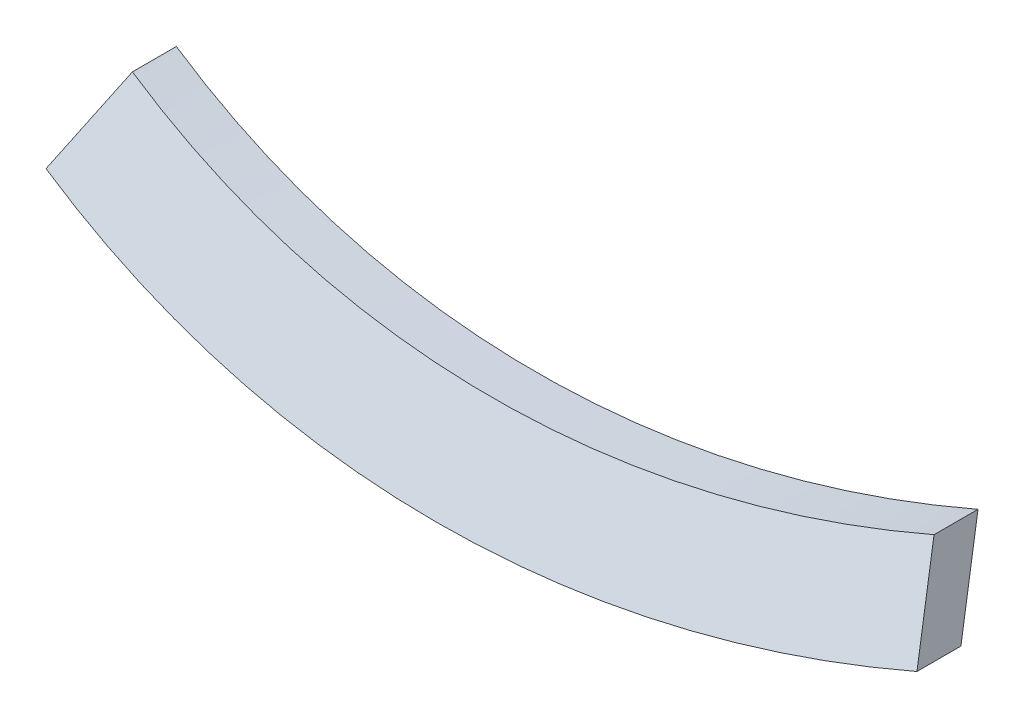
ISO-10303-21;
HEADER;
FILE_DESCRIPTION(('STEP AP214'),'2;1');
FILE_NAME('part.step','',(''),(''),'','','');
FILE_SCHEMA(('AUTOMOTIVE_DESIGN { 1 0 10303 214 1 1 1 1 }'));
ENDSEC;
DATA;
#1=APPLICATION_CONTEXT('core data for automotive mechanical design processes');
#2=APPLICATION_PROTOCOL_DEFINITION('international standard','automotive_design',2000,#1);
#3=PRODUCT_CONTEXT('',#1,'mechanical');
#4=PRODUCT('Part','Part','',(#3));
#5=PRODUCT_RELATED_PRODUCT_CATEGORY('part','',(#4));
#6=PRODUCT_DEFINITION_FORMATION('','',#4);
#7=PRODUCT_DEFINITION_CONTEXT('part definition',#1,'design');
#8=PRODUCT_DEFINITION('design','',#6,#7);
#9=PRODUCT_DEFINITION_SHAPE('','',#8);
#10=(LENGTH_UNIT() NAMED_UNIT(*) SI_UNIT(.MILLI.,.METRE.));
#11=(NAMED_UNIT(*) PLANE_ANGLE_UNIT() SI_UNIT($,.RADIAN.));
#12=(NAMED_UNIT(*) SI_UNIT($,.STERADIAN.) SOLID_ANGLE_UNIT());
#13=UNCERTAINTY_MEASURE_WITH_UNIT(LENGTH_MEASURE(1.E-05),#10,'distance_accuracy_value','');
#14=(GEOMETRIC_REPRESENTATION_CONTEXT(3) GLOBAL_UNCERTAINTY_ASSIGNED_CONTEXT((#13)) GLOBAL_UNIT_ASSIGNED_CONTEXT((#10,
#11,#12)) REPRESENTATION_CONTEXT('',''));
#15=CARTESIAN_POINT('',(0.,0.,0.));
#16=DIRECTION('',(0.,0.,1.));
#17=DIRECTION('',(1.,0.,0.));
#18=AXIS2_PLACEMENT_3D('',#15,#16,#17);
#19=CARTESIAN_POINT('',(0.,-126.899387052667,-166.639753894631));
#20=DIRECTION('',(0.,-0.56640623692483,-0.824126188622017));
#21=DIRECTION('',(0.,0.824126188622017,-0.56640623692483));
#22=AXIS2_PLACEMENT_3D('',#19,#20,#21);
#23=PLANE('',#22);
#24=DIRECTION('',(0.354677344708417,-0.770548723105769,0.52958346506538));
#25=VECTOR('',#24,1.);
#26=CARTESIAN_POINT('',(178.284528713164,-79.5509102038807,-199.181460451591));
#27=LINE('',#26,#25);
#28=CARTESIAN_POINT('',(164.097434924827,-48.72896127965,-220.364799054206));
#29=VERTEX_POINT('',#28);
#30=CARTESIAN_POINT('',(178.284528713164,-79.5509102038808,-199.181460451591));
#31=VERTEX_POINT('',#30);
#32=EDGE_CURVE('E81',#29,#31,#27,.T.);
#33=ORIENTED_EDGE('',*,*,#32,.F.);
#34=CARTESIAN_POINT('',(0.,307.778356801829,-465.385490373735));
#35=DIRECTION('',(0.,0.566406236924833,0.824126188622016));
#36=DIRECTION('',(0.,0.824126188622016,-0.566406236924833));
#37=AXIS2_PLACEMENT_3D('',#34,#35,#36);
#38=CIRCLE('',#37,462.666807939857);
#39=CARTESIAN_POINT('',(-164.097434924827,-48.72896127965,-220.364799054206));
#40=VERTEX_POINT('',#39);
#41=EDGE_CURVE('E88',#40,#29,#38,.T.);
#42=ORIENTED_EDGE('',*,*,#41,.F.);
#43=DIRECTION('',(0.354677344708416,0.77054872310577,-0.52958346506538));
#44=VECTOR('',#43,1.);
#45=CARTESIAN_POINT('',(-178.284528713164,-79.5509102038808,-199.181460451591));
#46=LINE('',#45,#44);
#47=CARTESIAN_POINT('',(-178.284528713164,-79.5509102038808,-199.181460451591));
#48=VERTEX_POINT('',#47);
#49=EDGE_CURVE('E115',#48,#40,#46,.T.);
#50=ORIENTED_EDGE('',*,*,#49,.F.);
#51=CARTESIAN_POINT('',(0.,307.778356801829,-465.385490373735));
#52=DIRECTION('',(0.,-0.566406236924832,-0.824126188622016));
#53=DIRECTION('',(0.,0.824126188622016,-0.566406236924832));
#54=AXIS2_PLACEMENT_3D('',#51,#52,#53);
#55=CIRCLE('',#54,502.666807939857);
#56=EDGE_CURVE('E50',#31,#48,#55,.T.);
#57=ORIENTED_EDGE('',*,*,#56,.F.);
#58=EDGE_LOOP('',(#33,#42,#50,#57));
#59=FACE_BOUND('',#58,.T.);
#60=ADVANCED_FACE('F40',(#59),#23,.F.);
#61=CARTESIAN_POINT('',(0.,-126.899387052667,-184.639753894631));
#62=DIRECTION('',(0.,-0.56640623692483,-0.824126188622017));
#63=DIRECTION('',(0.,0.824126188622017,-0.56640623692483));
#64=AXIS2_PLACEMENT_3D('',#61,#62,#63);
#65=PLANE('',#64);
#66=DIRECTION('',(0.354677344708417,-0.770548723105769,0.52958346506538));
#67=VECTOR('',#66,1.);
#68=CARTESIAN_POINT('',(178.284528713164,-79.5509102038807,-217.181460451591));
#69=LINE('',#68,#67);
#70=CARTESIAN_POINT('',(164.097434924827,-48.72896127965,-238.364799054206));
#71=VERTEX_POINT('',#70);
#72=CARTESIAN_POINT('',(178.284528713164,-79.5509102038808,-217.181460451591));
#73=VERTEX_POINT('',#72);
#74=EDGE_CURVE('E100',#71,#73,#69,.T.);
#75=ORIENTED_EDGE('',*,*,#74,.T.);
#76=CARTESIAN_POINT('',(0.,307.778356801829,-483.385490373735));
#77=DIRECTION('',(0.,-0.566406236924832,-0.824126188622016));
#78=DIRECTION('',(0.,0.824126188622016,-0.566406236924832));
#79=AXIS2_PLACEMENT_3D('',#76,#77,#78);
#80=CIRCLE('',#79,502.666807939857);
#81=CARTESIAN_POINT('',(-178.284528713164,-79.5509102038808,-217.181460451591));
#82=VERTEX_POINT('',#81);
#83=EDGE_CURVE('E12',#73,#82,#80,.T.);
#84=ORIENTED_EDGE('',*,*,#83,.T.);
#85=DIRECTION('',(0.354677344708416,0.77054872310577,-0.52958346506538));
#86=VECTOR('',#85,1.);
#87=CARTESIAN_POINT('',(-178.284528713164,-79.5509102038808,-217.181460451591));
#88=LINE('',#87,#86);
#89=CARTESIAN_POINT('',(-164.097434924827,-48.72896127965,-238.364799054206));
#90=VERTEX_POINT('',#89);
#91=EDGE_CURVE('E59',#82,#90,#88,.T.);
#92=ORIENTED_EDGE('',*,*,#91,.T.);
#93=CARTESIAN_POINT('',(0.,307.778356801829,-483.385490373735));
#94=DIRECTION('',(0.,0.566406236924833,0.824126188622016));
#95=DIRECTION('',(0.,0.824126188622016,-0.566406236924833));
#96=AXIS2_PLACEMENT_3D('',#93,#94,#95);
#97=CIRCLE('',#96,462.666807939857);
#98=EDGE_CURVE('E119',#90,#71,#97,.T.);
#99=ORIENTED_EDGE('',*,*,#98,.T.);
#100=EDGE_LOOP('',(#75,#84,#92,#99));
#101=FACE_BOUND('',#100,.T.);
#102=ADVANCED_FACE('F145',(#101),#65,.T.);
#103=CARTESIAN_POINT('',(178.284528713164,-79.5509102038807,-217.181460451591));
#104=DIRECTION('',(-0.908389751212693,-0.418124455027138,0.));
#105=DIRECTION('',(0.418124455027138,-0.908389751212693,0.));
#106=AXIS2_PLACEMENT_3D('',#103,#104,#105);
#107=PLANE('',#106);
#108=ORIENTED_EDGE('',*,*,#32,.T.);
#109=DIRECTION('',(0.,0.,1.));
#110=VECTOR('',#109,1.);
#111=CARTESIAN_POINT('',(178.284528713164,-79.5509102038807,-217.181460451591));
#112=LINE('',#111,#110);
#113=EDGE_CURVE('E96',#73,#31,#112,.T.);
#114=ORIENTED_EDGE('',*,*,#113,.F.);
#115=ORIENTED_EDGE('',*,*,#74,.F.);
#116=DIRECTION('',(0.,0.,1.));
#117=VECTOR('',#116,1.);
#118=CARTESIAN_POINT('',(164.097434924827,-48.72896127965,-238.364799054206));
#119=LINE('',#118,#117);
#120=EDGE_CURVE('E90',#71,#29,#119,.T.);
#121=ORIENTED_EDGE('',*,*,#120,.T.);
#122=EDGE_LOOP('',(#108,#114,#115,#121));
#123=FACE_BOUND('',#122,.T.);
#124=ADVANCED_FACE('F98',(#123),#107,.F.);
#125=DIRECTION('',(0.,0.,1.));
#126=VECTOR('',#125,1.);
#127=SURFACE_OF_LINEAR_EXTRUSION('',#97,#126);
#128=ORIENTED_EDGE('',*,*,#41,.T.);
#129=ORIENTED_EDGE('',*,*,#120,.F.);
#130=ORIENTED_EDGE('',*,*,#98,.F.);
#131=DIRECTION('',(0.,0.,1.));
#132=VECTOR('',#131,1.);
#133=CARTESIAN_POINT('',(-164.097434924827,-48.7289612796499,-238.364799054206));
#134=LINE('',#133,#132);
#135=EDGE_CURVE('E92',#90,#40,#134,.T.);
#136=ORIENTED_EDGE('',*,*,#135,.T.);
#137=EDGE_LOOP('',(#128,#129,#130,#136));
#138=FACE_BOUND('',#137,.T.);
#139=ADVANCED_FACE('F89',(#138),#127,.F.);
#140=CARTESIAN_POINT('',(-178.284528713164,-79.5509102038808,-217.181460451591));
#141=DIRECTION('',(0.908389751212693,-0.418124455027138,0.));
#142=DIRECTION('',(0.418124455027138,0.908389751212693,0.));
#143=AXIS2_PLACEMENT_3D('',#140,#141,#142);
#144=PLANE('',#143);
#145=ORIENTED_EDGE('',*,*,#49,.T.);
#146=ORIENTED_EDGE('',*,*,#135,.F.);
#147=ORIENTED_EDGE('',*,*,#91,.F.);
#148=DIRECTION('',(0.,0.,1.));
#149=VECTOR('',#148,1.);
#150=CARTESIAN_POINT('',(-178.284528713164,-79.5509102038808,-217.181460451591));
#151=LINE('',#150,#149);
#152=EDGE_CURVE('E118',#82,#48,#151,.T.);
#153=ORIENTED_EDGE('',*,*,#152,.T.);
#154=EDGE_LOOP('',(#145,#146,#147,#153));
#155=FACE_BOUND('',#154,.T.);
#156=ADVANCED_FACE('F139',(#155),#144,.F.);
#157=DIRECTION('',(0.,0.,1.));
#158=VECTOR('',#157,1.);
#159=SURFACE_OF_LINEAR_EXTRUSION('',#80,#158);
#160=ORIENTED_EDGE('',*,*,#56,.T.);
#161=ORIENTED_EDGE('',*,*,#152,.F.);
#162=ORIENTED_EDGE('',*,*,#83,.F.);
#163=ORIENTED_EDGE('',*,*,#113,.T.);
#164=EDGE_LOOP('',(#160,#161,#162,#163));
#165=FACE_BOUND('',#164,.T.);
#166=ADVANCED_FACE('F142',(#165),#159,.F.);
#167=CLOSED_SHELL('',(#60,#102,#124,#139,#156,#166));
#168=MANIFOLD_SOLID_BREP('B2',#167);
#169=ADVANCED_BREP_SHAPE_REPRESENTATION('',(#18,#168),#14);
#170=SHAPE_DEFINITION_REPRESENTATION(#9,#169);
ENDSEC;
END-ISO-10303-21;
